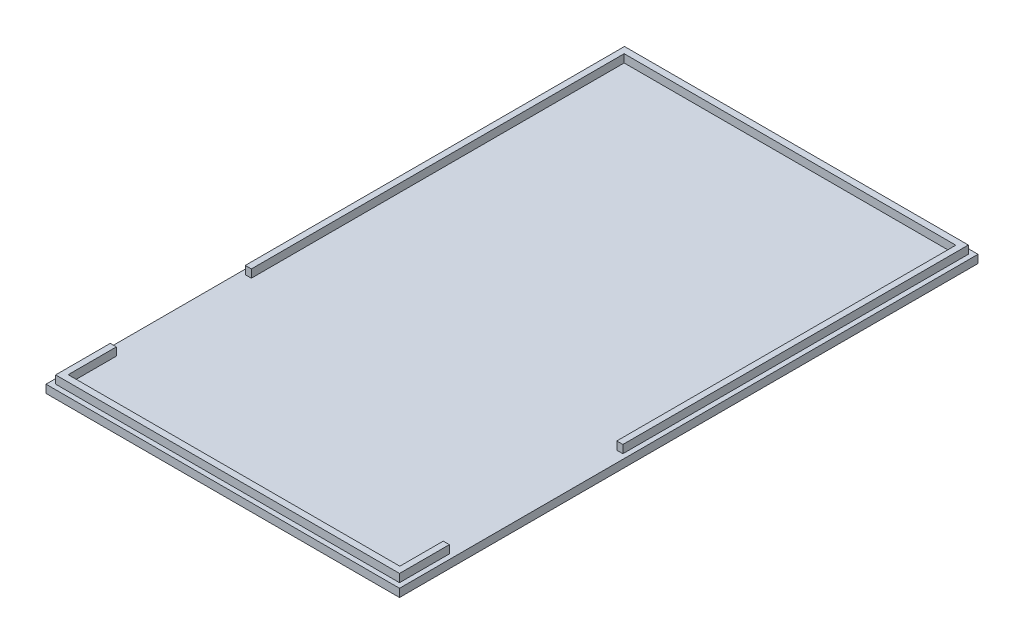
ISO-10303-21;
HEADER;
FILE_DESCRIPTION(('STEP AP214'),'2;1');
FILE_NAME('part.step','',(''),(''),'','','');
FILE_SCHEMA(('AUTOMOTIVE_DESIGN { 1 0 10303 214 1 1 1 1 }'));
ENDSEC;
DATA;
#1=APPLICATION_CONTEXT('core data for automotive mechanical design processes');
#2=APPLICATION_PROTOCOL_DEFINITION('international standard','automotive_design',2000,#1);
#3=PRODUCT_CONTEXT('',#1,'mechanical');
#4=PRODUCT('Part','Part','',(#3));
#5=PRODUCT_RELATED_PRODUCT_CATEGORY('part','',(#4));
#6=PRODUCT_DEFINITION_FORMATION('','',#4);
#7=PRODUCT_DEFINITION_CONTEXT('part definition',#1,'design');
#8=PRODUCT_DEFINITION('design','',#6,#7);
#9=PRODUCT_DEFINITION_SHAPE('','',#8);
#10=(LENGTH_UNIT() NAMED_UNIT(*) SI_UNIT(.MILLI.,.METRE.));
#11=(NAMED_UNIT(*) PLANE_ANGLE_UNIT() SI_UNIT($,.RADIAN.));
#12=(NAMED_UNIT(*) SI_UNIT($,.STERADIAN.) SOLID_ANGLE_UNIT());
#13=UNCERTAINTY_MEASURE_WITH_UNIT(LENGTH_MEASURE(1.E-05),#10,'distance_accuracy_value','');
#14=(GEOMETRIC_REPRESENTATION_CONTEXT(3) GLOBAL_UNCERTAINTY_ASSIGNED_CONTEXT((#13)) GLOBAL_UNIT_ASSIGNED_CONTEXT((#10,
#11,#12)) REPRESENTATION_CONTEXT('',''));
#15=CARTESIAN_POINT('',(0.,0.,0.));
#16=DIRECTION('',(0.,0.,1.));
#17=DIRECTION('',(1.,0.,0.));
#18=AXIS2_PLACEMENT_3D('',#15,#16,#17);
#19=CARTESIAN_POINT('',(0.,1.25,0.));
#20=DIRECTION('',(0.,1.,0.));
#21=DIRECTION('',(0.,0.,1.));
#22=AXIS2_PLACEMENT_3D('',#19,#20,#21);
#23=PLANE('',#22);
#24=DIRECTION('',(0.,0.,1.));
#25=VECTOR('',#24,1.);
#26=CARTESIAN_POINT('',(-55.,1.25,90.0000000000001));
#27=LINE('',#26,#25);
#28=CARTESIAN_POINT('',(-55.,1.25,-89.9999999999999));
#29=VERTEX_POINT('',#28);
#30=CARTESIAN_POINT('',(-55.,1.25,90.0000000000001));
#31=VERTEX_POINT('',#30);
#32=EDGE_CURVE('E317',#29,#31,#27,.T.);
#33=ORIENTED_EDGE('',*,*,#32,.T.);
#34=DIRECTION('',(1.,0.,0.));
#35=VECTOR('',#34,1.);
#36=CARTESIAN_POINT('',(55.,1.25,90.));
#37=LINE('',#36,#35);
#38=CARTESIAN_POINT('',(55.,1.25,90.));
#39=VERTEX_POINT('',#38);
#40=EDGE_CURVE('E321',#31,#39,#37,.T.);
#41=ORIENTED_EDGE('',*,*,#40,.T.);
#42=DIRECTION('',(0.,0.,-1.));
#43=VECTOR('',#42,1.);
#44=CARTESIAN_POINT('',(55.,1.25,90.));
#45=LINE('',#44,#43);
#46=CARTESIAN_POINT('',(55.,1.25,-90.));
#47=VERTEX_POINT('',#46);
#48=EDGE_CURVE('E325',#39,#47,#45,.T.);
#49=ORIENTED_EDGE('',*,*,#48,.T.);
#50=DIRECTION('',(-1.,0.,0.));
#51=VECTOR('',#50,1.);
#52=CARTESIAN_POINT('',(55.,1.25,-90.));
#53=LINE('',#52,#51);
#54=EDGE_CURVE('E328',#47,#29,#53,.T.);
#55=ORIENTED_EDGE('',*,*,#54,.T.);
#56=EDGE_LOOP('',(#33,#41,#49,#55));
#57=FACE_BOUND('',#56,.T.);
#58=DIRECTION('',(1.,0.,0.));
#59=VECTOR('',#58,1.);
#60=CARTESIAN_POINT('',(-51.6,1.25,29.5000000000001));
#61=LINE('',#60,#59);
#62=CARTESIAN_POINT('',(-53.5,1.25,29.5000000000001));
#63=VERTEX_POINT('',#62);
#64=CARTESIAN_POINT('',(-51.6,1.25,29.5000000000001));
#65=VERTEX_POINT('',#64);
#66=EDGE_CURVE('E214',#63,#65,#61,.T.);
#67=ORIENTED_EDGE('',*,*,#66,.F.);
#68=DIRECTION('',(0.,0.,1.));
#69=VECTOR('',#68,1.);
#70=CARTESIAN_POINT('',(-53.5,1.25,29.5000000000001));
#71=LINE('',#70,#69);
#72=CARTESIAN_POINT('',(-53.5,1.25,-88.5));
#73=VERTEX_POINT('',#72);
#74=EDGE_CURVE('E209',#73,#63,#71,.T.);
#75=ORIENTED_EDGE('',*,*,#74,.F.);
#76=DIRECTION('',(-1.,0.,0.));
#77=VECTOR('',#76,1.);
#78=CARTESIAN_POINT('',(53.5,1.25,-88.5));
#79=LINE('',#78,#77);
#80=CARTESIAN_POINT('',(53.5,1.25,-88.5));
#81=VERTEX_POINT('',#80);
#82=EDGE_CURVE('E247',#81,#73,#79,.T.);
#83=ORIENTED_EDGE('',*,*,#82,.F.);
#84=DIRECTION('',(0.,0.,-1.));
#85=VECTOR('',#84,1.);
#86=CARTESIAN_POINT('',(53.5,1.25,19.));
#87=LINE('',#86,#85);
#88=CARTESIAN_POINT('',(53.5,1.25,19.));
#89=VERTEX_POINT('',#88);
#90=EDGE_CURVE('E283',#89,#81,#87,.T.);
#91=ORIENTED_EDGE('',*,*,#90,.F.);
#92=DIRECTION('',(1.,0.,0.));
#93=VECTOR('',#92,1.);
#94=CARTESIAN_POINT('',(51.6,1.25,19.));
#95=LINE('',#94,#93);
#96=CARTESIAN_POINT('',(51.6,1.25,19.));
#97=VERTEX_POINT('',#96);
#98=EDGE_CURVE('E280',#97,#89,#95,.T.);
#99=ORIENTED_EDGE('',*,*,#98,.F.);
#100=DIRECTION('',(0.,0.,1.));
#101=VECTOR('',#100,1.);
#102=CARTESIAN_POINT('',(51.6,1.25,19.));
#103=LINE('',#102,#101);
#104=CARTESIAN_POINT('',(51.6,1.25,-86.5));
#105=VERTEX_POINT('',#104);
#106=EDGE_CURVE('E277',#105,#97,#103,.T.);
#107=ORIENTED_EDGE('',*,*,#106,.F.);
#108=DIRECTION('',(1.,0.,0.));
#109=VECTOR('',#108,1.);
#110=CARTESIAN_POINT('',(51.6,1.25,-86.5));
#111=LINE('',#110,#109);
#112=CARTESIAN_POINT('',(-51.6,1.25,-86.5));
#113=VERTEX_POINT('',#112);
#114=EDGE_CURVE('E274',#113,#105,#111,.T.);
#115=ORIENTED_EDGE('',*,*,#114,.F.);
#116=DIRECTION('',(0.,0.,-1.));
#117=VECTOR('',#116,1.);
#118=CARTESIAN_POINT('',(-51.6,1.25,29.5000000000001));
#119=LINE('',#118,#117);
#120=EDGE_CURVE('E271',#65,#113,#119,.T.);
#121=ORIENTED_EDGE('',*,*,#120,.F.);
#122=EDGE_LOOP('',(#67,#75,#83,#91,#99,#107,#115,#121));
#123=FACE_BOUND('',#122,.T.);
#124=DIRECTION('',(-1.,0.,0.));
#125=VECTOR('',#124,1.);
#126=CARTESIAN_POINT('',(51.6,1.25,73.));
#127=LINE('',#126,#125);
#128=CARTESIAN_POINT('',(53.5,1.25,73.));
#129=VERTEX_POINT('',#128);
#130=CARTESIAN_POINT('',(51.6,1.25,73.));
#131=VERTEX_POINT('',#130);
#132=EDGE_CURVE('E207',#129,#131,#127,.T.);
#133=ORIENTED_EDGE('',*,*,#132,.F.);
#134=DIRECTION('',(0.,0.,-1.));
#135=VECTOR('',#134,1.);
#136=CARTESIAN_POINT('',(53.5,1.25,88.4999999999999));
#137=LINE('',#136,#135);
#138=CARTESIAN_POINT('',(53.5,1.25,88.4999999999999));
#139=VERTEX_POINT('',#138);
#140=EDGE_CURVE('E200',#139,#129,#137,.T.);
#141=ORIENTED_EDGE('',*,*,#140,.F.);
#142=DIRECTION('',(1.,0.,0.));
#143=VECTOR('',#142,1.);
#144=CARTESIAN_POINT('',(53.5,1.25,88.4999999999999));
#145=LINE('',#144,#143);
#146=CARTESIAN_POINT('',(-53.5,1.25,88.4999999999999));
#147=VERTEX_POINT('',#146);
#148=EDGE_CURVE('E184',#147,#139,#145,.T.);
#149=ORIENTED_EDGE('',*,*,#148,.F.);
#150=DIRECTION('',(0.,0.,1.));
#151=VECTOR('',#150,1.);
#152=CARTESIAN_POINT('',(-53.5,1.25,88.4999999999999));
#153=LINE('',#152,#151);
#154=CARTESIAN_POINT('',(-53.5,1.25,71.5));
#155=VERTEX_POINT('',#154);
#156=EDGE_CURVE('E193',#155,#147,#153,.T.);
#157=ORIENTED_EDGE('',*,*,#156,.F.);
#158=DIRECTION('',(-1.,0.,0.));
#159=VECTOR('',#158,1.);
#160=CARTESIAN_POINT('',(-51.6,1.25,71.5));
#161=LINE('',#160,#159);
#162=CARTESIAN_POINT('',(-51.6,1.25,71.5));
#163=VERTEX_POINT('',#162);
#164=EDGE_CURVE('E607',#163,#155,#161,.T.);
#165=ORIENTED_EDGE('',*,*,#164,.F.);
#166=DIRECTION('',(0.,0.,-1.));
#167=VECTOR('',#166,1.);
#168=CARTESIAN_POINT('',(-51.6,1.25,86.5));
#169=LINE('',#168,#167);
#170=CARTESIAN_POINT('',(-51.6,1.25,86.5));
#171=VERTEX_POINT('',#170);
#172=EDGE_CURVE('E610',#171,#163,#169,.T.);
#173=ORIENTED_EDGE('',*,*,#172,.F.);
#174=DIRECTION('',(-1.,0.,0.));
#175=VECTOR('',#174,1.);
#176=CARTESIAN_POINT('',(51.6,1.25,86.5));
#177=LINE('',#176,#175);
#178=CARTESIAN_POINT('',(51.6,1.25,86.5));
#179=VERTEX_POINT('',#178);
#180=EDGE_CURVE('E613',#179,#171,#177,.T.);
#181=ORIENTED_EDGE('',*,*,#180,.F.);
#182=DIRECTION('',(0.,0.,1.));
#183=VECTOR('',#182,1.);
#184=CARTESIAN_POINT('',(51.6,1.25,86.5));
#185=LINE('',#184,#183);
#186=EDGE_CURVE('E216',#131,#179,#185,.T.);
#187=ORIENTED_EDGE('',*,*,#186,.F.);
#188=EDGE_LOOP('',(#133,#141,#149,#157,#165,#173,#181,#187));
#189=FACE_BOUND('',#188,.T.);
#190=ADVANCED_FACE('F45',(#57,#123,#189),#23,.T.);
#191=CARTESIAN_POINT('',(-55.,1.25,90.0000000000001));
#192=DIRECTION('',(1.,0.,0.));
#193=DIRECTION('',(0.,0.,-1.));
#194=AXIS2_PLACEMENT_3D('',#191,#192,#193);
#195=PLANE('',#194);
#196=DIRECTION('',(0.,0.,1.));
#197=VECTOR('',#196,1.);
#198=CARTESIAN_POINT('',(-55.,-1.25,90.0000000000001));
#199=LINE('',#198,#197);
#200=CARTESIAN_POINT('',(-55.,-1.25,-89.9999999999999));
#201=VERTEX_POINT('',#200);
#202=CARTESIAN_POINT('',(-55.,-1.25,90.0000000000001));
#203=VERTEX_POINT('',#202);
#204=EDGE_CURVE('E316',#201,#203,#199,.T.);
#205=ORIENTED_EDGE('',*,*,#204,.T.);
#206=DIRECTION('',(0.,-1.,0.));
#207=VECTOR('',#206,1.);
#208=CARTESIAN_POINT('',(-55.,1.25,90.0000000000001));
#209=LINE('',#208,#207);
#210=EDGE_CURVE('E11',#31,#203,#209,.T.);
#211=ORIENTED_EDGE('',*,*,#210,.F.);
#212=ORIENTED_EDGE('',*,*,#32,.F.);
#213=DIRECTION('',(0.,-1.,0.));
#214=VECTOR('',#213,1.);
#215=CARTESIAN_POINT('',(-55.,1.25,-89.9999999999999));
#216=LINE('',#215,#214);
#217=EDGE_CURVE('E331',#29,#201,#216,.T.);
#218=ORIENTED_EDGE('',*,*,#217,.T.);
#219=EDGE_LOOP('',(#205,#211,#212,#218));
#220=FACE_BOUND('',#219,.T.);
#221=ADVANCED_FACE('F47',(#220),#195,.F.);
#222=CARTESIAN_POINT('',(55.,1.25,90.));
#223=DIRECTION('',(0.,0.,-1.));
#224=DIRECTION('',(-1.,0.,0.));
#225=AXIS2_PLACEMENT_3D('',#222,#223,#224);
#226=PLANE('',#225);
#227=DIRECTION('',(1.,0.,0.));
#228=VECTOR('',#227,1.);
#229=CARTESIAN_POINT('',(55.,-1.25,90.));
#230=LINE('',#229,#228);
#231=CARTESIAN_POINT('',(55.,-1.25,90.));
#232=VERTEX_POINT('',#231);
#233=EDGE_CURVE('E335',#203,#232,#230,.T.);
#234=ORIENTED_EDGE('',*,*,#233,.T.);
#235=DIRECTION('',(0.,-1.,0.));
#236=VECTOR('',#235,1.);
#237=CARTESIAN_POINT('',(55.,1.25,90.));
#238=LINE('',#237,#236);
#239=EDGE_CURVE('E54',#39,#232,#238,.T.);
#240=ORIENTED_EDGE('',*,*,#239,.F.);
#241=ORIENTED_EDGE('',*,*,#40,.F.);
#242=ORIENTED_EDGE('',*,*,#210,.T.);
#243=EDGE_LOOP('',(#234,#240,#241,#242));
#244=FACE_BOUND('',#243,.T.);
#245=ADVANCED_FACE('F371',(#244),#226,.F.);
#246=CARTESIAN_POINT('',(55.,1.25,90.));
#247=DIRECTION('',(-1.,0.,0.));
#248=DIRECTION('',(0.,0.,1.));
#249=AXIS2_PLACEMENT_3D('',#246,#247,#248);
#250=PLANE('',#249);
#251=DIRECTION('',(0.,0.,-1.));
#252=VECTOR('',#251,1.);
#253=CARTESIAN_POINT('',(55.,-1.25,90.));
#254=LINE('',#253,#252);
#255=CARTESIAN_POINT('',(55.,-1.25,-90.));
#256=VERTEX_POINT('',#255);
#257=EDGE_CURVE('E338',#232,#256,#254,.T.);
#258=ORIENTED_EDGE('',*,*,#257,.T.);
#259=DIRECTION('',(0.,-1.,0.));
#260=VECTOR('',#259,1.);
#261=CARTESIAN_POINT('',(55.,1.25,-90.));
#262=LINE('',#261,#260);
#263=EDGE_CURVE('E346',#47,#256,#262,.T.);
#264=ORIENTED_EDGE('',*,*,#263,.F.);
#265=ORIENTED_EDGE('',*,*,#48,.F.);
#266=ORIENTED_EDGE('',*,*,#239,.T.);
#267=EDGE_LOOP('',(#258,#264,#265,#266));
#268=FACE_BOUND('',#267,.T.);
#269=ADVANCED_FACE('F355',(#268),#250,.F.);
#270=CARTESIAN_POINT('',(55.,1.25,-90.));
#271=DIRECTION('',(0.,0.,1.));
#272=DIRECTION('',(1.,0.,0.));
#273=AXIS2_PLACEMENT_3D('',#270,#271,#272);
#274=PLANE('',#273);
#275=DIRECTION('',(-1.,0.,0.));
#276=VECTOR('',#275,1.);
#277=CARTESIAN_POINT('',(55.,-1.25,-90.));
#278=LINE('',#277,#276);
#279=EDGE_CURVE('E322',#256,#201,#278,.T.);
#280=ORIENTED_EDGE('',*,*,#279,.T.);
#281=ORIENTED_EDGE('',*,*,#217,.F.);
#282=ORIENTED_EDGE('',*,*,#54,.F.);
#283=ORIENTED_EDGE('',*,*,#263,.T.);
#284=EDGE_LOOP('',(#280,#281,#282,#283));
#285=FACE_BOUND('',#284,.T.);
#286=ADVANCED_FACE('F364',(#285),#274,.F.);
#287=CARTESIAN_POINT('',(0.,-1.25,0.));
#288=DIRECTION('',(0.,1.,0.));
#289=DIRECTION('',(0.,0.,1.));
#290=AXIS2_PLACEMENT_3D('',#287,#288,#289);
#291=PLANE('',#290);
#292=ORIENTED_EDGE('',*,*,#204,.F.);
#293=ORIENTED_EDGE('',*,*,#279,.F.);
#294=ORIENTED_EDGE('',*,*,#257,.F.);
#295=ORIENTED_EDGE('',*,*,#233,.F.);
#296=EDGE_LOOP('',(#292,#293,#294,#295));
#297=FACE_BOUND('',#296,.T.);
#298=ADVANCED_FACE('F361',(#297),#291,.F.);
#299=CARTESIAN_POINT('',(-53.5,3.75,29.5000000000001));
#300=DIRECTION('',(1.,0.,0.));
#301=DIRECTION('',(0.,0.,-1.));
#302=AXIS2_PLACEMENT_3D('',#299,#300,#301);
#303=PLANE('',#302);
#304=ORIENTED_EDGE('',*,*,#74,.T.);
#305=DIRECTION('',(0.,-1.,0.));
#306=VECTOR('',#305,1.);
#307=CARTESIAN_POINT('',(-53.5,3.75,29.5000000000001));
#308=LINE('',#307,#306);
#309=CARTESIAN_POINT('',(-53.5,3.75,29.5000000000001));
#310=VERTEX_POINT('',#309);
#311=EDGE_CURVE('E313',#310,#63,#308,.T.);
#312=ORIENTED_EDGE('',*,*,#311,.F.);
#313=DIRECTION('',(0.,0.,1.));
#314=VECTOR('',#313,1.);
#315=CARTESIAN_POINT('',(-53.5,3.75,29.5000000000001));
#316=LINE('',#315,#314);
#317=CARTESIAN_POINT('',(-53.5,3.75,-88.5));
#318=VERTEX_POINT('',#317);
#319=EDGE_CURVE('E242',#318,#310,#316,.T.);
#320=ORIENTED_EDGE('',*,*,#319,.F.);
#321=DIRECTION('',(0.,-1.,0.));
#322=VECTOR('',#321,1.);
#323=CARTESIAN_POINT('',(-53.5,3.75,-88.5));
#324=LINE('',#323,#322);
#325=EDGE_CURVE('E267',#318,#73,#324,.T.);
#326=ORIENTED_EDGE('',*,*,#325,.T.);
#327=EDGE_LOOP('',(#304,#312,#320,#326));
#328=FACE_BOUND('',#327,.T.);
#329=ADVANCED_FACE('F386',(#328),#303,.F.);
#330=CARTESIAN_POINT('',(-51.6,3.75,29.5000000000001));
#331=DIRECTION('',(0.,0.,-1.));
#332=DIRECTION('',(-1.,0.,0.));
#333=AXIS2_PLACEMENT_3D('',#330,#331,#332);
#334=PLANE('',#333);
#335=ORIENTED_EDGE('',*,*,#66,.T.);
#336=DIRECTION('',(0.,-1.,0.));
#337=VECTOR('',#336,1.);
#338=CARTESIAN_POINT('',(-51.6,3.75,29.5000000000001));
#339=LINE('',#338,#337);
#340=CARTESIAN_POINT('',(-51.6,3.75,29.5000000000001));
#341=VERTEX_POINT('',#340);
#342=EDGE_CURVE('E309',#341,#65,#339,.T.);
#343=ORIENTED_EDGE('',*,*,#342,.F.);
#344=DIRECTION('',(1.,0.,0.));
#345=VECTOR('',#344,1.);
#346=CARTESIAN_POINT('',(-51.6,3.75,29.5000000000001));
#347=LINE('',#346,#345);
#348=EDGE_CURVE('E246',#310,#341,#347,.T.);
#349=ORIENTED_EDGE('',*,*,#348,.F.);
#350=ORIENTED_EDGE('',*,*,#311,.T.);
#351=EDGE_LOOP('',(#335,#343,#349,#350));
#352=FACE_BOUND('',#351,.T.);
#353=ADVANCED_FACE('F412',(#352),#334,.F.);
#354=CARTESIAN_POINT('',(-51.6,3.75,29.5000000000001));
#355=DIRECTION('',(-1.,0.,0.));
#356=DIRECTION('',(0.,0.,1.));
#357=AXIS2_PLACEMENT_3D('',#354,#355,#356);
#358=PLANE('',#357);
#359=ORIENTED_EDGE('',*,*,#120,.T.);
#360=DIRECTION('',(0.,-1.,0.));
#361=VECTOR('',#360,1.);
#362=CARTESIAN_POINT('',(-51.6,3.75,-86.5));
#363=LINE('',#362,#361);
#364=CARTESIAN_POINT('',(-51.6,3.75,-86.5));
#365=VERTEX_POINT('',#364);
#366=EDGE_CURVE('E305',#365,#113,#363,.T.);
#367=ORIENTED_EDGE('',*,*,#366,.F.);
#368=DIRECTION('',(0.,0.,-1.));
#369=VECTOR('',#368,1.);
#370=CARTESIAN_POINT('',(-51.6,3.75,29.5000000000001));
#371=LINE('',#370,#369);
#372=EDGE_CURVE('E250',#341,#365,#371,.T.);
#373=ORIENTED_EDGE('',*,*,#372,.F.);
#374=ORIENTED_EDGE('',*,*,#342,.T.);
#375=EDGE_LOOP('',(#359,#367,#373,#374));
#376=FACE_BOUND('',#375,.T.);
#377=ADVANCED_FACE('F421',(#376),#358,.F.);
#378=CARTESIAN_POINT('',(51.6,3.75,-86.5));
#379=DIRECTION('',(0.,0.,-1.));
#380=DIRECTION('',(-1.,0.,0.));
#381=AXIS2_PLACEMENT_3D('',#378,#379,#380);
#382=PLANE('',#381);
#383=ORIENTED_EDGE('',*,*,#114,.T.);
#384=DIRECTION('',(0.,-1.,0.));
#385=VECTOR('',#384,1.);
#386=CARTESIAN_POINT('',(51.6,3.75,-86.5));
#387=LINE('',#386,#385);
#388=CARTESIAN_POINT('',(51.6,3.75,-86.5));
#389=VERTEX_POINT('',#388);
#390=EDGE_CURVE('E301',#389,#105,#387,.T.);
#391=ORIENTED_EDGE('',*,*,#390,.F.);
#392=DIRECTION('',(1.,0.,0.));
#393=VECTOR('',#392,1.);
#394=CARTESIAN_POINT('',(51.6,3.75,-86.5));
#395=LINE('',#394,#393);
#396=EDGE_CURVE('E253',#365,#389,#395,.T.);
#397=ORIENTED_EDGE('',*,*,#396,.F.);
#398=ORIENTED_EDGE('',*,*,#366,.T.);
#399=EDGE_LOOP('',(#383,#391,#397,#398));
#400=FACE_BOUND('',#399,.T.);
#401=ADVANCED_FACE('F430',(#400),#382,.F.);
#402=CARTESIAN_POINT('',(51.6,3.75,19.));
#403=DIRECTION('',(1.,0.,0.));
#404=DIRECTION('',(0.,0.,-1.));
#405=AXIS2_PLACEMENT_3D('',#402,#403,#404);
#406=PLANE('',#405);
#407=ORIENTED_EDGE('',*,*,#106,.T.);
#408=DIRECTION('',(0.,-1.,0.));
#409=VECTOR('',#408,1.);
#410=CARTESIAN_POINT('',(51.6,3.75,19.));
#411=LINE('',#410,#409);
#412=CARTESIAN_POINT('',(51.6,3.75,19.));
#413=VERTEX_POINT('',#412);
#414=EDGE_CURVE('E297',#413,#97,#411,.T.);
#415=ORIENTED_EDGE('',*,*,#414,.F.);
#416=DIRECTION('',(0.,0.,1.));
#417=VECTOR('',#416,1.);
#418=CARTESIAN_POINT('',(51.6,3.75,19.));
#419=LINE('',#418,#417);
#420=EDGE_CURVE('E256',#389,#413,#419,.T.);
#421=ORIENTED_EDGE('',*,*,#420,.F.);
#422=ORIENTED_EDGE('',*,*,#390,.T.);
#423=EDGE_LOOP('',(#407,#415,#421,#422));
#424=FACE_BOUND('',#423,.T.);
#425=ADVANCED_FACE('F440',(#424),#406,.F.);
#426=CARTESIAN_POINT('',(51.6,3.75,19.));
#427=DIRECTION('',(0.,0.,-1.));
#428=DIRECTION('',(-1.,0.,0.));
#429=AXIS2_PLACEMENT_3D('',#426,#427,#428);
#430=PLANE('',#429);
#431=ORIENTED_EDGE('',*,*,#98,.T.);
#432=DIRECTION('',(0.,-1.,0.));
#433=VECTOR('',#432,1.);
#434=CARTESIAN_POINT('',(53.5,3.75,19.));
#435=LINE('',#434,#433);
#436=CARTESIAN_POINT('',(53.5,3.75,19.));
#437=VERTEX_POINT('',#436);
#438=EDGE_CURVE('E293',#437,#89,#435,.T.);
#439=ORIENTED_EDGE('',*,*,#438,.F.);
#440=DIRECTION('',(1.,0.,0.));
#441=VECTOR('',#440,1.);
#442=CARTESIAN_POINT('',(51.6,3.75,19.));
#443=LINE('',#442,#441);
#444=EDGE_CURVE('E259',#413,#437,#443,.T.);
#445=ORIENTED_EDGE('',*,*,#444,.F.);
#446=ORIENTED_EDGE('',*,*,#414,.T.);
#447=EDGE_LOOP('',(#431,#439,#445,#446));
#448=FACE_BOUND('',#447,.T.);
#449=ADVANCED_FACE('F450',(#448),#430,.F.);
#450=CARTESIAN_POINT('',(53.5,3.75,19.));
#451=DIRECTION('',(-1.,0.,0.));
#452=DIRECTION('',(0.,0.,1.));
#453=AXIS2_PLACEMENT_3D('',#450,#451,#452);
#454=PLANE('',#453);
#455=ORIENTED_EDGE('',*,*,#90,.T.);
#456=DIRECTION('',(0.,-1.,0.));
#457=VECTOR('',#456,1.);
#458=CARTESIAN_POINT('',(53.5,3.75,-88.5));
#459=LINE('',#458,#457);
#460=CARTESIAN_POINT('',(53.5,3.75,-88.5));
#461=VERTEX_POINT('',#460);
#462=EDGE_CURVE('E69',#461,#81,#459,.T.);
#463=ORIENTED_EDGE('',*,*,#462,.F.);
#464=DIRECTION('',(0.,0.,-1.));
#465=VECTOR('',#464,1.);
#466=CARTESIAN_POINT('',(53.5,3.75,19.));
#467=LINE('',#466,#465);
#468=EDGE_CURVE('E262',#437,#461,#467,.T.);
#469=ORIENTED_EDGE('',*,*,#468,.F.);
#470=ORIENTED_EDGE('',*,*,#438,.T.);
#471=EDGE_LOOP('',(#455,#463,#469,#470));
#472=FACE_BOUND('',#471,.T.);
#473=ADVANCED_FACE('F460',(#472),#454,.F.);
#474=CARTESIAN_POINT('',(53.5,3.75,-88.5));
#475=DIRECTION('',(0.,0.,1.));
#476=DIRECTION('',(1.,0.,0.));
#477=AXIS2_PLACEMENT_3D('',#474,#475,#476);
#478=PLANE('',#477);
#479=ORIENTED_EDGE('',*,*,#82,.T.);
#480=ORIENTED_EDGE('',*,*,#325,.F.);
#481=DIRECTION('',(-1.,0.,0.));
#482=VECTOR('',#481,1.);
#483=CARTESIAN_POINT('',(53.5,3.75,-88.5));
#484=LINE('',#483,#482);
#485=EDGE_CURVE('E265',#461,#318,#484,.T.);
#486=ORIENTED_EDGE('',*,*,#485,.F.);
#487=ORIENTED_EDGE('',*,*,#462,.T.);
#488=EDGE_LOOP('',(#479,#480,#486,#487));
#489=FACE_BOUND('',#488,.T.);
#490=ADVANCED_FACE('F470',(#489),#478,.F.);
#491=CARTESIAN_POINT('',(0.,3.75,0.));
#492=DIRECTION('',(0.,1.,0.));
#493=DIRECTION('',(0.,0.,1.));
#494=AXIS2_PLACEMENT_3D('',#491,#492,#493);
#495=PLANE('',#494);
#496=ORIENTED_EDGE('',*,*,#319,.T.);
#497=ORIENTED_EDGE('',*,*,#348,.T.);
#498=ORIENTED_EDGE('',*,*,#372,.T.);
#499=ORIENTED_EDGE('',*,*,#396,.T.);
#500=ORIENTED_EDGE('',*,*,#420,.T.);
#501=ORIENTED_EDGE('',*,*,#444,.T.);
#502=ORIENTED_EDGE('',*,*,#468,.T.);
#503=ORIENTED_EDGE('',*,*,#485,.T.);
#504=EDGE_LOOP('',(#496,#497,#498,#499,#500,#501,#502,#503));
#505=FACE_BOUND('',#504,.T.);
#506=ADVANCED_FACE('F480',(#505),#495,.T.);
#507=CARTESIAN_POINT('',(53.5,3.75,88.4999999999999));
#508=DIRECTION('',(-1.,0.,0.));
#509=DIRECTION('',(0.,0.,1.));
#510=AXIS2_PLACEMENT_3D('',#507,#508,#509);
#511=PLANE('',#510);
#512=ORIENTED_EDGE('',*,*,#140,.T.);
#513=DIRECTION('',(0.,-1.,0.));
#514=VECTOR('',#513,1.);
#515=CARTESIAN_POINT('',(53.5,3.75,73.));
#516=LINE('',#515,#514);
#517=CARTESIAN_POINT('',(53.5,3.75,73.));
#518=VERTEX_POINT('',#517);
#519=EDGE_CURVE('E579',#518,#129,#516,.T.);
#520=ORIENTED_EDGE('',*,*,#519,.F.);
#521=DIRECTION('',(0.,0.,-1.));
#522=VECTOR('',#521,1.);
#523=CARTESIAN_POINT('',(53.5,3.75,88.4999999999999));
#524=LINE('',#523,#522);
#525=CARTESIAN_POINT('',(53.5,3.75,88.4999999999999));
#526=VERTEX_POINT('',#525);
#527=EDGE_CURVE('E194',#526,#518,#524,.T.);
#528=ORIENTED_EDGE('',*,*,#527,.F.);
#529=DIRECTION('',(0.,-1.,0.));
#530=VECTOR('',#529,1.);
#531=CARTESIAN_POINT('',(53.5,3.75,88.4999999999999));
#532=LINE('',#531,#530);
#533=EDGE_CURVE('E187',#526,#139,#532,.T.);
#534=ORIENTED_EDGE('',*,*,#533,.T.);
#535=EDGE_LOOP('',(#512,#520,#528,#534));
#536=FACE_BOUND('',#535,.T.);
#537=ADVANCED_FACE('F198',(#536),#511,.F.);
#538=CARTESIAN_POINT('',(51.6,3.75,73.));
#539=DIRECTION('',(0.,0.,1.));
#540=DIRECTION('',(1.,0.,0.));
#541=AXIS2_PLACEMENT_3D('',#538,#539,#540);
#542=PLANE('',#541);
#543=ORIENTED_EDGE('',*,*,#132,.T.);
#544=DIRECTION('',(0.,-1.,0.));
#545=VECTOR('',#544,1.);
#546=CARTESIAN_POINT('',(51.6,3.75,73.));
#547=LINE('',#546,#545);
#548=CARTESIAN_POINT('',(51.6,3.75,73.));
#549=VERTEX_POINT('',#548);
#550=EDGE_CURVE('E581',#549,#131,#547,.T.);
#551=ORIENTED_EDGE('',*,*,#550,.F.);
#552=DIRECTION('',(-1.,0.,0.));
#553=VECTOR('',#552,1.);
#554=CARTESIAN_POINT('',(51.6,3.75,73.));
#555=LINE('',#554,#553);
#556=EDGE_CURVE('E237',#518,#549,#555,.T.);
#557=ORIENTED_EDGE('',*,*,#556,.F.);
#558=ORIENTED_EDGE('',*,*,#519,.T.);
#559=EDGE_LOOP('',(#543,#551,#557,#558));
#560=FACE_BOUND('',#559,.T.);
#561=ADVANCED_FACE('F498',(#560),#542,.F.);
#562=CARTESIAN_POINT('',(51.6,3.75,86.5));
#563=DIRECTION('',(1.,0.,0.));
#564=DIRECTION('',(0.,0.,-1.));
#565=AXIS2_PLACEMENT_3D('',#562,#563,#564);
#566=PLANE('',#565);
#567=ORIENTED_EDGE('',*,*,#186,.T.);
#568=DIRECTION('',(0.,-1.,0.));
#569=VECTOR('',#568,1.);
#570=CARTESIAN_POINT('',(51.6,3.75,86.5));
#571=LINE('',#570,#569);
#572=CARTESIAN_POINT('',(51.6,3.75,86.5));
#573=VERTEX_POINT('',#572);
#574=EDGE_CURVE('E585',#573,#179,#571,.T.);
#575=ORIENTED_EDGE('',*,*,#574,.F.);
#576=DIRECTION('',(0.,0.,1.));
#577=VECTOR('',#576,1.);
#578=CARTESIAN_POINT('',(51.6,3.75,86.5));
#579=LINE('',#578,#577);
#580=EDGE_CURVE('E234',#549,#573,#579,.T.);
#581=ORIENTED_EDGE('',*,*,#580,.F.);
#582=ORIENTED_EDGE('',*,*,#550,.T.);
#583=EDGE_LOOP('',(#567,#575,#581,#582));
#584=FACE_BOUND('',#583,.T.);
#585=ADVANCED_FACE('F507',(#584),#566,.F.);
#586=CARTESIAN_POINT('',(51.6,3.75,86.5));
#587=DIRECTION('',(0.,0.,1.));
#588=DIRECTION('',(1.,0.,0.));
#589=AXIS2_PLACEMENT_3D('',#586,#587,#588);
#590=PLANE('',#589);
#591=ORIENTED_EDGE('',*,*,#180,.T.);
#592=DIRECTION('',(0.,-1.,0.));
#593=VECTOR('',#592,1.);
#594=CARTESIAN_POINT('',(-51.6,3.75,86.5));
#595=LINE('',#594,#593);
#596=CARTESIAN_POINT('',(-51.6,3.75,86.5));
#597=VERTEX_POINT('',#596);
#598=EDGE_CURVE('E591',#597,#171,#595,.T.);
#599=ORIENTED_EDGE('',*,*,#598,.F.);
#600=DIRECTION('',(-1.,0.,0.));
#601=VECTOR('',#600,1.);
#602=CARTESIAN_POINT('',(51.6,3.75,86.5));
#603=LINE('',#602,#601);
#604=EDGE_CURVE('E231',#573,#597,#603,.T.);
#605=ORIENTED_EDGE('',*,*,#604,.F.);
#606=ORIENTED_EDGE('',*,*,#574,.T.);
#607=EDGE_LOOP('',(#591,#599,#605,#606));
#608=FACE_BOUND('',#607,.T.);
#609=ADVANCED_FACE('F517',(#608),#590,.F.);
#610=CARTESIAN_POINT('',(-51.6,3.75,86.5));
#611=DIRECTION('',(-1.,0.,0.));
#612=DIRECTION('',(0.,0.,1.));
#613=AXIS2_PLACEMENT_3D('',#610,#611,#612);
#614=PLANE('',#613);
#615=ORIENTED_EDGE('',*,*,#172,.T.);
#616=DIRECTION('',(0.,-1.,0.));
#617=VECTOR('',#616,1.);
#618=CARTESIAN_POINT('',(-51.6,3.75,71.5));
#619=LINE('',#618,#617);
#620=CARTESIAN_POINT('',(-51.6,3.75,71.5));
#621=VERTEX_POINT('',#620);
#622=EDGE_CURVE('E595',#621,#163,#619,.T.);
#623=ORIENTED_EDGE('',*,*,#622,.F.);
#624=DIRECTION('',(0.,0.,-1.));
#625=VECTOR('',#624,1.);
#626=CARTESIAN_POINT('',(-51.6,3.75,86.5));
#627=LINE('',#626,#625);
#628=EDGE_CURVE('E228',#597,#621,#627,.T.);
#629=ORIENTED_EDGE('',*,*,#628,.F.);
#630=ORIENTED_EDGE('',*,*,#598,.T.);
#631=EDGE_LOOP('',(#615,#623,#629,#630));
#632=FACE_BOUND('',#631,.T.);
#633=ADVANCED_FACE('F527',(#632),#614,.F.);
#634=CARTESIAN_POINT('',(-51.6,3.75,71.5));
#635=DIRECTION('',(0.,0.,1.));
#636=DIRECTION('',(1.,0.,0.));
#637=AXIS2_PLACEMENT_3D('',#634,#635,#636);
#638=PLANE('',#637);
#639=ORIENTED_EDGE('',*,*,#164,.T.);
#640=DIRECTION('',(0.,-1.,0.));
#641=VECTOR('',#640,1.);
#642=CARTESIAN_POINT('',(-53.5,3.75,71.5));
#643=LINE('',#642,#641);
#644=CARTESIAN_POINT('',(-53.5,3.75,71.5));
#645=VERTEX_POINT('',#644);
#646=EDGE_CURVE('E599',#645,#155,#643,.T.);
#647=ORIENTED_EDGE('',*,*,#646,.F.);
#648=DIRECTION('',(-1.,0.,0.));
#649=VECTOR('',#648,1.);
#650=CARTESIAN_POINT('',(-51.6,3.75,71.5));
#651=LINE('',#650,#649);
#652=EDGE_CURVE('E225',#621,#645,#651,.T.);
#653=ORIENTED_EDGE('',*,*,#652,.F.);
#654=ORIENTED_EDGE('',*,*,#622,.T.);
#655=EDGE_LOOP('',(#639,#647,#653,#654));
#656=FACE_BOUND('',#655,.T.);
#657=ADVANCED_FACE('F537',(#656),#638,.F.);
#658=CARTESIAN_POINT('',(-53.5,3.75,88.4999999999999));
#659=DIRECTION('',(1.,0.,0.));
#660=DIRECTION('',(0.,0.,-1.));
#661=AXIS2_PLACEMENT_3D('',#658,#659,#660);
#662=PLANE('',#661);
#663=ORIENTED_EDGE('',*,*,#156,.T.);
#664=DIRECTION('',(0.,-1.,0.));
#665=VECTOR('',#664,1.);
#666=CARTESIAN_POINT('',(-53.5,3.75,88.4999999999999));
#667=LINE('',#666,#665);
#668=CARTESIAN_POINT('',(-53.5,3.75,88.4999999999999));
#669=VERTEX_POINT('',#668);
#670=EDGE_CURVE('E61',#669,#147,#667,.T.);
#671=ORIENTED_EDGE('',*,*,#670,.F.);
#672=DIRECTION('',(0.,0.,1.));
#673=VECTOR('',#672,1.);
#674=CARTESIAN_POINT('',(-53.5,3.75,88.4999999999999));
#675=LINE('',#674,#673);
#676=EDGE_CURVE('E222',#645,#669,#675,.T.);
#677=ORIENTED_EDGE('',*,*,#676,.F.);
#678=ORIENTED_EDGE('',*,*,#646,.T.);
#679=EDGE_LOOP('',(#663,#671,#677,#678));
#680=FACE_BOUND('',#679,.T.);
#681=ADVANCED_FACE('F547',(#680),#662,.F.);
#682=CARTESIAN_POINT('',(53.5,3.75,88.4999999999999));
#683=DIRECTION('',(0.,0.,-1.));
#684=DIRECTION('',(-1.,0.,0.));
#685=AXIS2_PLACEMENT_3D('',#682,#683,#684);
#686=PLANE('',#685);
#687=ORIENTED_EDGE('',*,*,#148,.T.);
#688=ORIENTED_EDGE('',*,*,#533,.F.);
#689=DIRECTION('',(1.,0.,0.));
#690=VECTOR('',#689,1.);
#691=CARTESIAN_POINT('',(53.5,3.75,88.4999999999999));
#692=LINE('',#691,#690);
#693=EDGE_CURVE('E204',#669,#526,#692,.T.);
#694=ORIENTED_EDGE('',*,*,#693,.F.);
#695=ORIENTED_EDGE('',*,*,#670,.T.);
#696=EDGE_LOOP('',(#687,#688,#694,#695));
#697=FACE_BOUND('',#696,.T.);
#698=ADVANCED_FACE('F186',(#697),#686,.F.);
#699=CARTESIAN_POINT('',(0.,3.75,0.));
#700=DIRECTION('',(0.,-1.,0.));
#701=DIRECTION('',(0.,0.,-1.));
#702=AXIS2_PLACEMENT_3D('',#699,#700,#701);
#703=PLANE('',#702);
#704=ORIENTED_EDGE('',*,*,#527,.T.);
#705=ORIENTED_EDGE('',*,*,#556,.T.);
#706=ORIENTED_EDGE('',*,*,#580,.T.);
#707=ORIENTED_EDGE('',*,*,#604,.T.);
#708=ORIENTED_EDGE('',*,*,#628,.T.);
#709=ORIENTED_EDGE('',*,*,#652,.T.);
#710=ORIENTED_EDGE('',*,*,#676,.T.);
#711=ORIENTED_EDGE('',*,*,#693,.T.);
#712=EDGE_LOOP('',(#704,#705,#706,#707,#708,#709,#710,#711));
#713=FACE_BOUND('',#712,.T.);
#714=ADVANCED_FACE('F566',(#713),#703,.F.);
#715=CLOSED_SHELL('',(#190,#221,#245,#269,#286,#298,#329,#353,#377,#401,#425,#449,#473,#490,
#506,#537,#561,#585,#609,#633,#657,#681,#698,#714));
#716=MANIFOLD_SOLID_BREP('B2',#715);
#717=ADVANCED_BREP_SHAPE_REPRESENTATION('',(#18,#716),#14);
#718=SHAPE_DEFINITION_REPRESENTATION(#9,#717);
ENDSEC;
END-ISO-10303-21;
